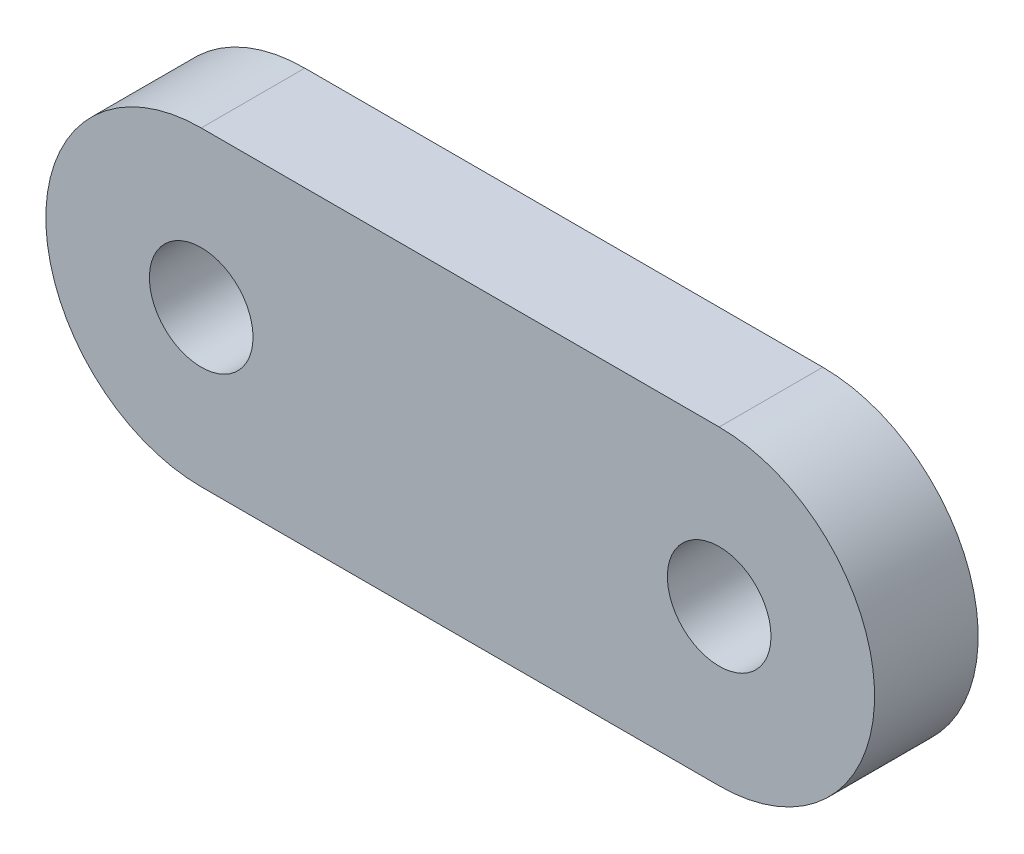
ISO-10303-21;
HEADER;
FILE_DESCRIPTION(('STEP AP214'),'2;1');
FILE_NAME('part.step','',(''),(''),'','','');
FILE_SCHEMA(('AUTOMOTIVE_DESIGN { 1 0 10303 214 1 1 1 1 }'));
ENDSEC;
DATA;
#1=APPLICATION_CONTEXT('core data for automotive mechanical design processes');
#2=APPLICATION_PROTOCOL_DEFINITION('international standard','automotive_design',2000,#1);
#3=PRODUCT_CONTEXT('',#1,'mechanical');
#4=PRODUCT('Part','Part','',(#3));
#5=PRODUCT_RELATED_PRODUCT_CATEGORY('part','',(#4));
#6=PRODUCT_DEFINITION_FORMATION('','',#4);
#7=PRODUCT_DEFINITION_CONTEXT('part definition',#1,'design');
#8=PRODUCT_DEFINITION('design','',#6,#7);
#9=PRODUCT_DEFINITION_SHAPE('','',#8);
#10=(LENGTH_UNIT() NAMED_UNIT(*) SI_UNIT(.MILLI.,.METRE.));
#11=(NAMED_UNIT(*) PLANE_ANGLE_UNIT() SI_UNIT($,.RADIAN.));
#12=(NAMED_UNIT(*) SI_UNIT($,.STERADIAN.) SOLID_ANGLE_UNIT());
#13=UNCERTAINTY_MEASURE_WITH_UNIT(LENGTH_MEASURE(1.E-05),#10,'distance_accuracy_value','');
#14=(GEOMETRIC_REPRESENTATION_CONTEXT(3) GLOBAL_UNCERTAINTY_ASSIGNED_CONTEXT((#13)) GLOBAL_UNIT_ASSIGNED_CONTEXT((#10,
#11,#12)) REPRESENTATION_CONTEXT('',''));
#15=CARTESIAN_POINT('',(0.,0.,0.));
#16=DIRECTION('',(0.,0.,1.));
#17=DIRECTION('',(1.,0.,0.));
#18=AXIS2_PLACEMENT_3D('',#15,#16,#17);
#19=CARTESIAN_POINT('',(-15.875,0.,6.35));
#20=DIRECTION('',(0.,0.,-1.));
#21=DIRECTION('',(-1.,0.,0.));
#22=AXIS2_PLACEMENT_3D('',#19,#20,#21);
#23=CYLINDRICAL_SURFACE('',#22,9.525);
#24=CARTESIAN_POINT('',(-15.875,0.,0.));
#25=DIRECTION('',(0.,0.,1.));
#26=DIRECTION('',(1.,0.,0.));
#27=AXIS2_PLACEMENT_3D('',#24,#25,#26);
#28=CIRCLE('',#27,9.525);
#29=CARTESIAN_POINT('',(-15.875,9.525,0.));
#30=VERTEX_POINT('',#29);
#31=CARTESIAN_POINT('',(-15.875,-9.525,0.));
#32=VERTEX_POINT('',#31);
#33=EDGE_CURVE('E97',#30,#32,#28,.T.);
#34=ORIENTED_EDGE('',*,*,#33,.T.);
#35=DIRECTION('',(0.,0.,-1.));
#36=VECTOR('',#35,1.);
#37=CARTESIAN_POINT('',(-15.875,-9.525,6.35));
#38=LINE('',#37,#36);
#39=CARTESIAN_POINT('',(-15.875,-9.525,6.35));
#40=VERTEX_POINT('',#39);
#41=EDGE_CURVE('E11',#40,#32,#38,.T.);
#42=ORIENTED_EDGE('',*,*,#41,.F.);
#43=CARTESIAN_POINT('',(-15.875,0.,6.35));
#44=DIRECTION('',(0.,0.,1.));
#45=DIRECTION('',(1.,0.,0.));
#46=AXIS2_PLACEMENT_3D('',#43,#44,#45);
#47=CIRCLE('',#46,9.525);
#48=CARTESIAN_POINT('',(-15.875,9.525,6.35));
#49=VERTEX_POINT('',#48);
#50=EDGE_CURVE('E85',#49,#40,#47,.T.);
#51=ORIENTED_EDGE('',*,*,#50,.F.);
#52=DIRECTION('',(0.,0.,-1.));
#53=VECTOR('',#52,1.);
#54=CARTESIAN_POINT('',(-15.875,9.525,6.35));
#55=LINE('',#54,#53);
#56=EDGE_CURVE('E93',#49,#30,#55,.T.);
#57=ORIENTED_EDGE('',*,*,#56,.T.);
#58=EDGE_LOOP('',(#34,#42,#51,#57));
#59=FACE_BOUND('',#58,.T.);
#60=ADVANCED_FACE('F34',(#59),#23,.T.);
#61=CARTESIAN_POINT('',(-15.875,-9.525,6.35));
#62=DIRECTION('',(0.,1.,0.));
#63=DIRECTION('',(-1.,0.,0.));
#64=AXIS2_PLACEMENT_3D('',#61,#62,#63);
#65=PLANE('',#64);
#66=DIRECTION('',(1.,0.,0.));
#67=VECTOR('',#66,1.);
#68=CARTESIAN_POINT('',(-15.875,-9.525,0.));
#69=LINE('',#68,#67);
#70=CARTESIAN_POINT('',(15.875,-9.525,0.));
#71=VERTEX_POINT('',#70);
#72=EDGE_CURVE('E89',#32,#71,#69,.T.);
#73=ORIENTED_EDGE('',*,*,#72,.T.);
#74=DIRECTION('',(0.,0.,-1.));
#75=VECTOR('',#74,1.);
#76=CARTESIAN_POINT('',(15.875,-9.525,6.35));
#77=LINE('',#76,#75);
#78=CARTESIAN_POINT('',(15.875,-9.525,6.35));
#79=VERTEX_POINT('',#78);
#80=EDGE_CURVE('E42',#79,#71,#77,.T.);
#81=ORIENTED_EDGE('',*,*,#80,.F.);
#82=DIRECTION('',(1.,0.,0.));
#83=VECTOR('',#82,1.);
#84=CARTESIAN_POINT('',(-15.875,-9.525,6.35));
#85=LINE('',#84,#83);
#86=EDGE_CURVE('E80',#40,#79,#85,.T.);
#87=ORIENTED_EDGE('',*,*,#86,.F.);
#88=ORIENTED_EDGE('',*,*,#41,.T.);
#89=EDGE_LOOP('',(#73,#81,#87,#88));
#90=FACE_BOUND('',#89,.T.);
#91=ADVANCED_FACE('F88',(#90),#65,.F.);
#92=CARTESIAN_POINT('',(15.875,0.,6.35));
#93=DIRECTION('',(0.,0.,-1.));
#94=DIRECTION('',(-1.,0.,0.));
#95=AXIS2_PLACEMENT_3D('',#92,#93,#94);
#96=CYLINDRICAL_SURFACE('',#95,9.525);
#97=CARTESIAN_POINT('',(15.875,0.,0.));
#98=DIRECTION('',(0.,0.,1.));
#99=DIRECTION('',(1.,0.,0.));
#100=AXIS2_PLACEMENT_3D('',#97,#98,#99);
#101=CIRCLE('',#100,9.525);
#102=CARTESIAN_POINT('',(15.875,9.52500000000001,0.));
#103=VERTEX_POINT('',#102);
#104=EDGE_CURVE('E67',#71,#103,#101,.T.);
#105=ORIENTED_EDGE('',*,*,#104,.T.);
#106=DIRECTION('',(0.,0.,-1.));
#107=VECTOR('',#106,1.);
#108=CARTESIAN_POINT('',(15.875,9.52500000000001,6.35));
#109=LINE('',#108,#107);
#110=CARTESIAN_POINT('',(15.875,9.52500000000001,6.35));
#111=VERTEX_POINT('',#110);
#112=EDGE_CURVE('E90',#111,#103,#109,.T.);
#113=ORIENTED_EDGE('',*,*,#112,.F.);
#114=CARTESIAN_POINT('',(15.875,0.,6.35));
#115=DIRECTION('',(0.,0.,1.));
#116=DIRECTION('',(1.,0.,0.));
#117=AXIS2_PLACEMENT_3D('',#114,#115,#116);
#118=CIRCLE('',#117,9.525);
#119=EDGE_CURVE('E83',#79,#111,#118,.T.);
#120=ORIENTED_EDGE('',*,*,#119,.F.);
#121=ORIENTED_EDGE('',*,*,#80,.T.);
#122=EDGE_LOOP('',(#105,#113,#120,#121));
#123=FACE_BOUND('',#122,.T.);
#124=ADVANCED_FACE('F91',(#123),#96,.T.);
#125=CARTESIAN_POINT('',(-15.875,9.525,6.35));
#126=DIRECTION('',(0.,-1.,0.));
#127=DIRECTION('',(1.,0.,0.));
#128=AXIS2_PLACEMENT_3D('',#125,#126,#127);
#129=PLANE('',#128);
#130=DIRECTION('',(-1.,0.,0.));
#131=VECTOR('',#130,1.);
#132=CARTESIAN_POINT('',(-15.875,9.525,0.));
#133=LINE('',#132,#131);
#134=EDGE_CURVE('E73',#103,#30,#133,.T.);
#135=ORIENTED_EDGE('',*,*,#134,.T.);
#136=ORIENTED_EDGE('',*,*,#56,.F.);
#137=DIRECTION('',(-1.,0.,0.));
#138=VECTOR('',#137,1.);
#139=CARTESIAN_POINT('',(-15.875,9.525,6.35));
#140=LINE('',#139,#138);
#141=EDGE_CURVE('E50',#111,#49,#140,.T.);
#142=ORIENTED_EDGE('',*,*,#141,.F.);
#143=ORIENTED_EDGE('',*,*,#112,.T.);
#144=EDGE_LOOP('',(#135,#136,#142,#143));
#145=FACE_BOUND('',#144,.T.);
#146=ADVANCED_FACE('F105',(#145),#129,.F.);
#147=CARTESIAN_POINT('',(-15.875,0.,6.35));
#148=DIRECTION('',(0.,0.,1.));
#149=DIRECTION('',(1.,0.,0.));
#150=AXIS2_PLACEMENT_3D('',#147,#148,#149);
#151=PLANE('',#150);
#152=CARTESIAN_POINT('',(15.875,0.,6.35));
#153=DIRECTION('',(0.,0.,1.));
#154=DIRECTION('',(1.,0.,0.));
#155=AXIS2_PLACEMENT_3D('',#152,#153,#154);
#156=CIRCLE('',#155,3.175);
#157=CARTESIAN_POINT('',(19.05,0.,6.35));
#158=VERTEX_POINT('',#157);
#159=EDGE_CURVE('E117',#158,#158,#156,.T.);
#160=ORIENTED_EDGE('',*,*,#159,.F.);
#161=EDGE_LOOP('',(#160));
#162=FACE_BOUND('',#161,.T.);
#163=CARTESIAN_POINT('',(-15.875,0.,6.35));
#164=DIRECTION('',(0.,0.,1.));
#165=DIRECTION('',(1.,0.,0.));
#166=AXIS2_PLACEMENT_3D('',#163,#164,#165);
#167=CIRCLE('',#166,3.175);
#168=CARTESIAN_POINT('',(-12.7,0.,6.35));
#169=VERTEX_POINT('',#168);
#170=EDGE_CURVE('E111',#169,#169,#167,.T.);
#171=ORIENTED_EDGE('',*,*,#170,.F.);
#172=EDGE_LOOP('',(#171));
#173=FACE_BOUND('',#172,.T.);
#174=ORIENTED_EDGE('',*,*,#50,.T.);
#175=ORIENTED_EDGE('',*,*,#86,.T.);
#176=ORIENTED_EDGE('',*,*,#119,.T.);
#177=ORIENTED_EDGE('',*,*,#141,.T.);
#178=EDGE_LOOP('',(#174,#175,#176,#177));
#179=FACE_BOUND('',#178,.T.);
#180=ADVANCED_FACE('F81',(#162,#173,#179),#151,.T.);
#181=CARTESIAN_POINT('',(-15.875,0.,0.));
#182=DIRECTION('',(0.,0.,1.));
#183=DIRECTION('',(1.,0.,0.));
#184=AXIS2_PLACEMENT_3D('',#181,#182,#183);
#185=PLANE('',#184);
#186=CARTESIAN_POINT('',(15.875,0.,0.));
#187=DIRECTION('',(0.,0.,1.));
#188=DIRECTION('',(1.,0.,0.));
#189=AXIS2_PLACEMENT_3D('',#186,#187,#188);
#190=CIRCLE('',#189,3.175);
#191=CARTESIAN_POINT('',(19.05,0.,0.));
#192=VERTEX_POINT('',#191);
#193=EDGE_CURVE('E114',#192,#192,#190,.T.);
#194=ORIENTED_EDGE('',*,*,#193,.T.);
#195=EDGE_LOOP('',(#194));
#196=FACE_BOUND('',#195,.T.);
#197=CARTESIAN_POINT('',(-15.875,0.,0.));
#198=DIRECTION('',(0.,0.,1.));
#199=DIRECTION('',(1.,0.,0.));
#200=AXIS2_PLACEMENT_3D('',#197,#198,#199);
#201=CIRCLE('',#200,3.175);
#202=CARTESIAN_POINT('',(-12.7,0.,0.));
#203=VERTEX_POINT('',#202);
#204=EDGE_CURVE('E100',#203,#203,#201,.T.);
#205=ORIENTED_EDGE('',*,*,#204,.T.);
#206=EDGE_LOOP('',(#205));
#207=FACE_BOUND('',#206,.T.);
#208=ORIENTED_EDGE('',*,*,#33,.F.);
#209=ORIENTED_EDGE('',*,*,#134,.F.);
#210=ORIENTED_EDGE('',*,*,#104,.F.);
#211=ORIENTED_EDGE('',*,*,#72,.F.);
#212=EDGE_LOOP('',(#208,#209,#210,#211));
#213=FACE_BOUND('',#212,.T.);
#214=ADVANCED_FACE('F108',(#196,#207,#213),#185,.F.);
#215=CARTESIAN_POINT('',(-15.875,0.,0.));
#216=DIRECTION('',(0.,0.,1.));
#217=DIRECTION('',(1.,0.,0.));
#218=AXIS2_PLACEMENT_3D('',#215,#216,#217);
#219=CYLINDRICAL_SURFACE('',#218,3.175);
#220=ORIENTED_EDGE('',*,*,#204,.F.);
#221=EDGE_LOOP('',(#220));
#222=FACE_BOUND('',#221,.T.);
#223=ORIENTED_EDGE('',*,*,#170,.T.);
#224=EDGE_LOOP('',(#223));
#225=FACE_BOUND('',#224,.T.);
#226=ADVANCED_FACE('F128',(#222,#225),#219,.F.);
#227=CARTESIAN_POINT('',(15.875,0.,0.));
#228=DIRECTION('',(0.,0.,1.));
#229=DIRECTION('',(1.,0.,0.));
#230=AXIS2_PLACEMENT_3D('',#227,#228,#229);
#231=CYLINDRICAL_SURFACE('',#230,3.175);
#232=ORIENTED_EDGE('',*,*,#193,.F.);
#233=EDGE_LOOP('',(#232));
#234=FACE_BOUND('',#233,.T.);
#235=ORIENTED_EDGE('',*,*,#159,.T.);
#236=EDGE_LOOP('',(#235));
#237=FACE_BOUND('',#236,.T.);
#238=ADVANCED_FACE('F125',(#234,#237),#231,.F.);
#239=CLOSED_SHELL('',(#60,#91,#124,#146,#180,#214,#226,#238));
#240=MANIFOLD_SOLID_BREP('B2',#239);
#241=ADVANCED_BREP_SHAPE_REPRESENTATION('',(#18,#240),#14);
#242=SHAPE_DEFINITION_REPRESENTATION(#9,#241);
ENDSEC;
END-ISO-10303-21;
